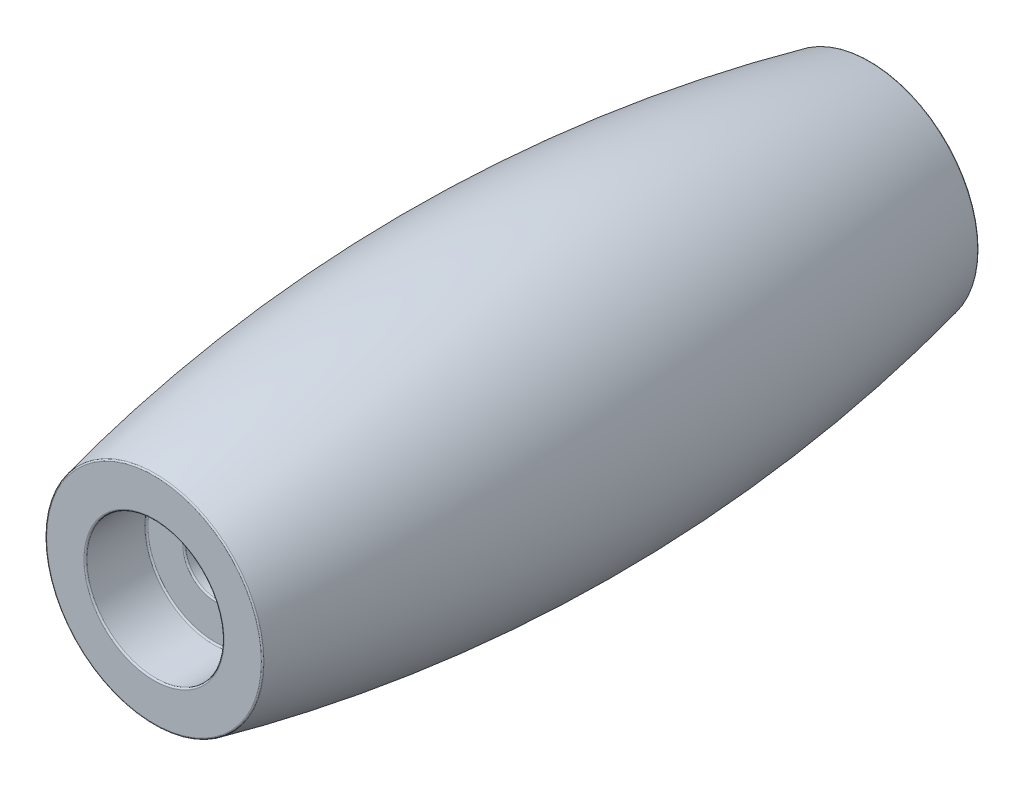
ISO-10303-21;
HEADER;
FILE_DESCRIPTION(('STEP AP214'),'2;1');
FILE_NAME('part.step','',(''),(''),'','','');
FILE_SCHEMA(('AUTOMOTIVE_DESIGN { 1 0 10303 214 1 1 1 1 }'));
ENDSEC;
DATA;
#1=APPLICATION_CONTEXT('core data for automotive mechanical design processes');
#2=APPLICATION_PROTOCOL_DEFINITION('international standard','automotive_design',2000,#1);
#3=PRODUCT_CONTEXT('',#1,'mechanical');
#4=PRODUCT('Part','Part','',(#3));
#5=PRODUCT_RELATED_PRODUCT_CATEGORY('part','',(#4));
#6=PRODUCT_DEFINITION_FORMATION('','',#4);
#7=PRODUCT_DEFINITION_CONTEXT('part definition',#1,'design');
#8=PRODUCT_DEFINITION('design','',#6,#7);
#9=PRODUCT_DEFINITION_SHAPE('','',#8);
#10=(LENGTH_UNIT() NAMED_UNIT(*) SI_UNIT(.MILLI.,.METRE.));
#11=(NAMED_UNIT(*) PLANE_ANGLE_UNIT() SI_UNIT($,.RADIAN.));
#12=(NAMED_UNIT(*) SI_UNIT($,.STERADIAN.) SOLID_ANGLE_UNIT());
#13=UNCERTAINTY_MEASURE_WITH_UNIT(LENGTH_MEASURE(1.E-05),#10,'distance_accuracy_value','');
#14=(GEOMETRIC_REPRESENTATION_CONTEXT(3) GLOBAL_UNCERTAINTY_ASSIGNED_CONTEXT((#13)) GLOBAL_UNIT_ASSIGNED_CONTEXT((#10,
#11,#12)) REPRESENTATION_CONTEXT('',''));
#15=CARTESIAN_POINT('',(0.,0.,0.));
#16=DIRECTION('',(0.,0.,1.));
#17=DIRECTION('',(1.,0.,0.));
#18=AXIS2_PLACEMENT_3D('',#15,#16,#17);
#19=CARTESIAN_POINT('',(2.00000000000001,0.,-19.5));
#20=DIRECTION('',(0.,0.,1.));
#21=DIRECTION('',(1.,0.,0.));
#22=AXIS2_PLACEMENT_3D('',#19,#20,#21);
#23=PLANE('',#22);
#24=CARTESIAN_POINT('',(0.,0.,-19.5));
#25=DIRECTION('',(0.,0.,1.));
#26=DIRECTION('',(1.,0.,0.));
#27=AXIS2_PLACEMENT_3D('',#24,#25,#26);
#28=CIRCLE('',#27,2.10000000000001);
#29=CARTESIAN_POINT('',(2.1,0.,-19.5));
#30=VERTEX_POINT('',#29);
#31=EDGE_CURVE('E75',#30,#30,#28,.T.);
#32=ORIENTED_EDGE('',*,*,#31,.T.);
#33=EDGE_LOOP('',(#32));
#34=FACE_BOUND('',#33,.T.);
#35=CARTESIAN_POINT('',(0.,0.,-19.5));
#36=DIRECTION('',(0.,0.,1.));
#37=DIRECTION('',(1.,0.,0.));
#38=AXIS2_PLACEMENT_3D('',#35,#36,#37);
#39=CIRCLE('',#38,4.40000000000002);
#40=CARTESIAN_POINT('',(4.40000000000001,0.,-19.5));
#41=VERTEX_POINT('',#40);
#42=EDGE_CURVE('E78',#41,#41,#39,.F.);
#43=ORIENTED_EDGE('',*,*,#42,.T.);
#44=EDGE_LOOP('',(#43));
#45=FACE_BOUND('',#44,.T.);
#46=ADVANCED_FACE('F31',(#34,#45),#23,.F.);
#47=CARTESIAN_POINT('',(0.,0.,-23.5));
#48=DIRECTION('',(0.,0.,-1.));
#49=DIRECTION('',(-1.,0.,0.));
#50=AXIS2_PLACEMENT_3D('',#47,#48,#49);
#51=CYLINDRICAL_SURFACE('',#50,4.50000000000002);
#52=CARTESIAN_POINT('',(0.,0.,-19.6));
#53=DIRECTION('',(0.,0.,1.));
#54=DIRECTION('',(1.,0.,0.));
#55=AXIS2_PLACEMENT_3D('',#52,#53,#54);
#56=CIRCLE('',#55,4.50000000000002);
#57=CARTESIAN_POINT('',(4.50000000000001,0.,-19.6));
#58=VERTEX_POINT('',#57);
#59=EDGE_CURVE('E69',#58,#58,#56,.T.);
#60=ORIENTED_EDGE('',*,*,#59,.T.);
#61=EDGE_LOOP('',(#60));
#62=FACE_BOUND('',#61,.T.);
#63=CARTESIAN_POINT('',(0.,0.,-23.4));
#64=DIRECTION('',(0.,0.,1.));
#65=DIRECTION('',(1.,0.,0.));
#66=AXIS2_PLACEMENT_3D('',#63,#64,#65);
#67=CIRCLE('',#66,4.50000000000002);
#68=CARTESIAN_POINT('',(4.5,0.,-23.4));
#69=VERTEX_POINT('',#68);
#70=EDGE_CURVE('E72',#69,#69,#67,.F.);
#71=ORIENTED_EDGE('',*,*,#70,.T.);
#72=EDGE_LOOP('',(#71));
#73=FACE_BOUND('',#72,.T.);
#74=ADVANCED_FACE('F124',(#62,#73),#51,.F.);
#75=CARTESIAN_POINT('',(4.5,0.,-23.5));
#76=DIRECTION('',(0.,0.,1.));
#77=DIRECTION('',(1.,0.,0.));
#78=AXIS2_PLACEMENT_3D('',#75,#76,#77);
#79=PLANE('',#78);
#80=CARTESIAN_POINT('',(0.,0.,-23.5));
#81=DIRECTION('',(0.,0.,1.));
#82=DIRECTION('',(1.,0.,0.));
#83=AXIS2_PLACEMENT_3D('',#80,#81,#82);
#84=CIRCLE('',#83,4.60000000000002);
#85=CARTESIAN_POINT('',(4.6,0.,-23.5));
#86=VERTEX_POINT('',#85);
#87=EDGE_CURVE('E63',#86,#86,#84,.T.);
#88=ORIENTED_EDGE('',*,*,#87,.T.);
#89=EDGE_LOOP('',(#88));
#90=FACE_BOUND('',#89,.T.);
#91=CARTESIAN_POINT('',(0.,0.,-23.5));
#92=DIRECTION('',(0.,0.,1.));
#93=DIRECTION('',(1.,0.,0.));
#94=AXIS2_PLACEMENT_3D('',#91,#92,#93);
#95=CIRCLE('',#94,7.044892785145);
#96=CARTESIAN_POINT('',(7.04489278514499,0.,-23.5));
#97=VERTEX_POINT('',#96);
#98=EDGE_CURVE('E66',#97,#97,#95,.F.);
#99=ORIENTED_EDGE('',*,*,#98,.T.);
#100=EDGE_LOOP('',(#99));
#101=FACE_BOUND('',#100,.T.);
#102=ADVANCED_FACE('F130',(#90,#101),#79,.F.);
#103=CARTESIAN_POINT('',(0.,0.,0.));
#104=DIRECTION('',(0.,0.,-1.));
#105=DIRECTION('',(-1.,0.,0.));
#106=AXIS2_PLACEMENT_3D('',#103,#104,#105);
#107=DEGENERATE_TOROIDAL_SURFACE('',#106,97.7769230769233,107.501923076923,.F.);
#108=CARTESIAN_POINT('',(0.,0.,-23.421787319379));
#109=DIRECTION('',(0.,0.,1.));
#110=DIRECTION('',(1.,0.,0.));
#111=AXIS2_PLACEMENT_3D('',#108,#109,#110);
#112=CIRCLE('',#111,7.14249049369534);
#113=CARTESIAN_POINT('',(7.14249049369533,0.,-23.421787319379));
#114=VERTEX_POINT('',#113);
#115=EDGE_CURVE('E57',#114,#114,#112,.T.);
#116=ORIENTED_EDGE('',*,*,#115,.T.);
#117=EDGE_LOOP('',(#116));
#118=FACE_BOUND('',#117,.T.);
#119=CARTESIAN_POINT('',(0.,0.,23.421787319379));
#120=DIRECTION('',(0.,0.,-1.));
#121=DIRECTION('',(-1.,0.,0.));
#122=AXIS2_PLACEMENT_3D('',#119,#120,#121);
#123=CIRCLE('',#122,7.14249049369533);
#124=CARTESIAN_POINT('',(-7.14249049369532,0.,23.421787319379));
#125=VERTEX_POINT('',#124);
#126=EDGE_CURVE('E60',#125,#125,#123,.T.);
#127=ORIENTED_EDGE('',*,*,#126,.T.);
#128=EDGE_LOOP('',(#127));
#129=FACE_BOUND('',#128,.T.);
#130=ADVANCED_FACE('F157',(#118,#129),#107,.F.);
#131=CARTESIAN_POINT('',(4.5,0.,23.5));
#132=DIRECTION('',(0.,0.,-1.));
#133=DIRECTION('',(-1.,0.,0.));
#134=AXIS2_PLACEMENT_3D('',#131,#132,#133);
#135=PLANE('',#134);
#136=CARTESIAN_POINT('',(0.,0.,23.5));
#137=DIRECTION('',(0.,0.,-1.));
#138=DIRECTION('',(-1.,0.,0.));
#139=AXIS2_PLACEMENT_3D('',#136,#137,#138);
#140=CIRCLE('',#139,4.60000000000001);
#141=CARTESIAN_POINT('',(-4.60000000000001,0.,23.5));
#142=VERTEX_POINT('',#141);
#143=EDGE_CURVE('E10',#142,#142,#140,.T.);
#144=ORIENTED_EDGE('',*,*,#143,.T.);
#145=EDGE_LOOP('',(#144));
#146=FACE_BOUND('',#145,.T.);
#147=CARTESIAN_POINT('',(0.,0.,23.5));
#148=DIRECTION('',(0.,0.,-1.));
#149=DIRECTION('',(-1.,0.,0.));
#150=AXIS2_PLACEMENT_3D('',#147,#148,#149);
#151=CIRCLE('',#150,7.04489278514499);
#152=CARTESIAN_POINT('',(-7.04489278514498,0.,23.5));
#153=VERTEX_POINT('',#152);
#154=EDGE_CURVE('E38',#153,#153,#151,.F.);
#155=ORIENTED_EDGE('',*,*,#154,.T.);
#156=EDGE_LOOP('',(#155));
#157=FACE_BOUND('',#156,.T.);
#158=ADVANCED_FACE('F113',(#146,#157),#135,.F.);
#159=CARTESIAN_POINT('',(0.,0.,-23.5));
#160=DIRECTION('',(0.,0.,-1.));
#161=DIRECTION('',(-1.,0.,0.));
#162=AXIS2_PLACEMENT_3D('',#159,#160,#161);
#163=CYLINDRICAL_SURFACE('',#162,4.50000000000001);
#164=CARTESIAN_POINT('',(0.,0.,19.6));
#165=DIRECTION('',(0.,0.,-1.));
#166=DIRECTION('',(-1.,0.,0.));
#167=AXIS2_PLACEMENT_3D('',#164,#165,#166);
#168=CIRCLE('',#167,4.50000000000001);
#169=CARTESIAN_POINT('',(-4.50000000000001,0.,19.6));
#170=VERTEX_POINT('',#169);
#171=EDGE_CURVE('E42',#170,#170,#168,.T.);
#172=ORIENTED_EDGE('',*,*,#171,.T.);
#173=EDGE_LOOP('',(#172));
#174=FACE_BOUND('',#173,.T.);
#175=CARTESIAN_POINT('',(0.,0.,23.4));
#176=DIRECTION('',(0.,0.,-1.));
#177=DIRECTION('',(-1.,0.,0.));
#178=AXIS2_PLACEMENT_3D('',#175,#176,#177);
#179=CIRCLE('',#178,4.50000000000001);
#180=CARTESIAN_POINT('',(-4.50000000000001,0.,23.4));
#181=VERTEX_POINT('',#180);
#182=EDGE_CURVE('E46',#181,#181,#179,.F.);
#183=ORIENTED_EDGE('',*,*,#182,.T.);
#184=EDGE_LOOP('',(#183));
#185=FACE_BOUND('',#184,.T.);
#186=ADVANCED_FACE('F101',(#174,#185),#163,.F.);
#187=CARTESIAN_POINT('',(2.00000000000001,0.,19.5));
#188=DIRECTION('',(0.,0.,-1.));
#189=DIRECTION('',(-1.,0.,0.));
#190=AXIS2_PLACEMENT_3D('',#187,#188,#189);
#191=PLANE('',#190);
#192=CARTESIAN_POINT('',(0.,0.,19.5));
#193=DIRECTION('',(0.,0.,-1.));
#194=DIRECTION('',(-1.,0.,0.));
#195=AXIS2_PLACEMENT_3D('',#192,#193,#194);
#196=CIRCLE('',#195,2.10000000000001);
#197=CARTESIAN_POINT('',(-2.10000000000001,0.,19.5));
#198=VERTEX_POINT('',#197);
#199=EDGE_CURVE('E51',#198,#198,#196,.T.);
#200=ORIENTED_EDGE('',*,*,#199,.T.);
#201=EDGE_LOOP('',(#200));
#202=FACE_BOUND('',#201,.T.);
#203=CARTESIAN_POINT('',(0.,0.,19.5));
#204=DIRECTION('',(0.,0.,-1.));
#205=DIRECTION('',(-1.,0.,0.));
#206=AXIS2_PLACEMENT_3D('',#203,#204,#205);
#207=CIRCLE('',#206,4.40000000000001);
#208=CARTESIAN_POINT('',(-4.40000000000001,0.,19.5));
#209=VERTEX_POINT('',#208);
#210=EDGE_CURVE('E54',#209,#209,#207,.F.);
#211=ORIENTED_EDGE('',*,*,#210,.T.);
#212=EDGE_LOOP('',(#211));
#213=FACE_BOUND('',#212,.T.);
#214=ADVANCED_FACE('F98',(#202,#213),#191,.F.);
#215=CARTESIAN_POINT('',(0.,0.,-23.5));
#216=DIRECTION('',(0.,0.,-1.));
#217=DIRECTION('',(-1.,0.,0.));
#218=AXIS2_PLACEMENT_3D('',#215,#216,#217);
#219=CYLINDRICAL_SURFACE('',#218,2.00000000000001);
#220=CARTESIAN_POINT('',(0.,0.,-19.4));
#221=DIRECTION('',(0.,0.,1.));
#222=DIRECTION('',(1.,0.,0.));
#223=AXIS2_PLACEMENT_3D('',#220,#221,#222);
#224=CIRCLE('',#223,2.00000000000001);
#225=CARTESIAN_POINT('',(2.,0.,-19.4));
#226=VERTEX_POINT('',#225);
#227=EDGE_CURVE('E81',#226,#226,#224,.F.);
#228=ORIENTED_EDGE('',*,*,#227,.T.);
#229=EDGE_LOOP('',(#228));
#230=FACE_BOUND('',#229,.T.);
#231=CARTESIAN_POINT('',(0.,0.,19.4));
#232=DIRECTION('',(0.,0.,-1.));
#233=DIRECTION('',(-1.,0.,0.));
#234=AXIS2_PLACEMENT_3D('',#231,#232,#233);
#235=CIRCLE('',#234,2.00000000000001);
#236=CARTESIAN_POINT('',(-2.00000000000001,0.,19.4));
#237=VERTEX_POINT('',#236);
#238=EDGE_CURVE('E84',#237,#237,#235,.F.);
#239=ORIENTED_EDGE('',*,*,#238,.T.);
#240=EDGE_LOOP('',(#239));
#241=FACE_BOUND('',#240,.T.);
#242=ADVANCED_FACE('F88',(#230,#241),#219,.F.);
#243=CARTESIAN_POINT('',(0.,0.,-19.4));
#244=DIRECTION('',(0.,0.,1.));
#245=DIRECTION('',(1.,0.,0.));
#246=AXIS2_PLACEMENT_3D('',#243,#244,#245);
#247=TOROIDAL_SURFACE('',#246,2.10000000000001,0.1);
#248=ORIENTED_EDGE('',*,*,#31,.F.);
#249=EDGE_LOOP('',(#248));
#250=FACE_BOUND('',#249,.T.);
#251=ORIENTED_EDGE('',*,*,#227,.F.);
#252=EDGE_LOOP('',(#251));
#253=FACE_BOUND('',#252,.T.);
#254=ADVANCED_FACE('F136',(#250,#253),#247,.T.);
#255=CARTESIAN_POINT('',(0.,0.,-19.6));
#256=DIRECTION('',(0.,0.,1.));
#257=DIRECTION('',(1.,0.,0.));
#258=AXIS2_PLACEMENT_3D('',#255,#256,#257);
#259=TOROIDAL_SURFACE('',#258,4.40000000000002,0.1);
#260=ORIENTED_EDGE('',*,*,#59,.F.);
#261=EDGE_LOOP('',(#260));
#262=FACE_BOUND('',#261,.T.);
#263=ORIENTED_EDGE('',*,*,#42,.F.);
#264=EDGE_LOOP('',(#263));
#265=FACE_BOUND('',#264,.T.);
#266=ADVANCED_FACE('F139',(#262,#265),#259,.F.);
#267=CARTESIAN_POINT('',(0.,0.,-23.4));
#268=DIRECTION('',(0.,0.,1.));
#269=DIRECTION('',(1.,0.,0.));
#270=AXIS2_PLACEMENT_3D('',#267,#268,#269);
#271=TOROIDAL_SURFACE('',#270,4.60000000000002,0.1);
#272=ORIENTED_EDGE('',*,*,#87,.F.);
#273=EDGE_LOOP('',(#272));
#274=FACE_BOUND('',#273,.T.);
#275=ORIENTED_EDGE('',*,*,#70,.F.);
#276=EDGE_LOOP('',(#275));
#277=FACE_BOUND('',#276,.T.);
#278=ADVANCED_FACE('F143',(#274,#277),#271,.T.);
#279=CARTESIAN_POINT('',(0.,0.,-23.4));
#280=DIRECTION('',(0.,0.,1.));
#281=DIRECTION('',(1.,0.,0.));
#282=AXIS2_PLACEMENT_3D('',#279,#280,#281);
#283=TOROIDAL_SURFACE('',#282,7.044892785145,0.1);
#284=ORIENTED_EDGE('',*,*,#115,.F.);
#285=EDGE_LOOP('',(#284));
#286=FACE_BOUND('',#285,.T.);
#287=ORIENTED_EDGE('',*,*,#98,.F.);
#288=EDGE_LOOP('',(#287));
#289=FACE_BOUND('',#288,.T.);
#290=ADVANCED_FACE('F94',(#286,#289),#283,.T.);
#291=CARTESIAN_POINT('',(0.,0.,19.4));
#292=DIRECTION('',(0.,0.,-1.));
#293=DIRECTION('',(-1.,0.,0.));
#294=AXIS2_PLACEMENT_3D('',#291,#292,#293);
#295=TOROIDAL_SURFACE('',#294,2.10000000000001,0.1);
#296=ORIENTED_EDGE('',*,*,#238,.F.);
#297=EDGE_LOOP('',(#296));
#298=FACE_BOUND('',#297,.T.);
#299=ORIENTED_EDGE('',*,*,#199,.F.);
#300=EDGE_LOOP('',(#299));
#301=FACE_BOUND('',#300,.T.);
#302=ADVANCED_FACE('F90',(#298,#301),#295,.T.);
#303=CARTESIAN_POINT('',(0.,0.,19.6));
#304=DIRECTION('',(0.,0.,-1.));
#305=DIRECTION('',(-1.,0.,0.));
#306=AXIS2_PLACEMENT_3D('',#303,#304,#305);
#307=TOROIDAL_SURFACE('',#306,4.40000000000001,0.1);
#308=ORIENTED_EDGE('',*,*,#210,.F.);
#309=EDGE_LOOP('',(#308));
#310=FACE_BOUND('',#309,.T.);
#311=ORIENTED_EDGE('',*,*,#171,.F.);
#312=EDGE_LOOP('',(#311));
#313=FACE_BOUND('',#312,.T.);
#314=ADVANCED_FACE('F93',(#310,#313),#307,.F.);
#315=CARTESIAN_POINT('',(0.,0.,23.4));
#316=DIRECTION('',(0.,0.,-1.));
#317=DIRECTION('',(-1.,0.,0.));
#318=AXIS2_PLACEMENT_3D('',#315,#316,#317);
#319=TOROIDAL_SURFACE('',#318,4.60000000000001,0.1);
#320=ORIENTED_EDGE('',*,*,#182,.F.);
#321=EDGE_LOOP('',(#320));
#322=FACE_BOUND('',#321,.T.);
#323=ORIENTED_EDGE('',*,*,#143,.F.);
#324=EDGE_LOOP('',(#323));
#325=FACE_BOUND('',#324,.T.);
#326=ADVANCED_FACE('F107',(#322,#325),#319,.T.);
#327=CARTESIAN_POINT('',(0.,0.,23.4));
#328=DIRECTION('',(0.,0.,-1.));
#329=DIRECTION('',(-1.,0.,0.));
#330=AXIS2_PLACEMENT_3D('',#327,#328,#329);
#331=TOROIDAL_SURFACE('',#330,7.04489278514499,0.1);
#332=ORIENTED_EDGE('',*,*,#154,.F.);
#333=EDGE_LOOP('',(#332));
#334=FACE_BOUND('',#333,.T.);
#335=ORIENTED_EDGE('',*,*,#126,.F.);
#336=EDGE_LOOP('',(#335));
#337=FACE_BOUND('',#336,.T.);
#338=ADVANCED_FACE('F33',(#334,#337),#331,.T.);
#339=CLOSED_SHELL('',(#46,#74,#102,#130,#158,#186,#214,#242,#254,#266,#278,#290,#302,#314,#326,#338));
#340=MANIFOLD_SOLID_BREP('B2',#339);
#341=ADVANCED_BREP_SHAPE_REPRESENTATION('',(#18,#340),#14);
#342=SHAPE_DEFINITION_REPRESENTATION(#9,#341);
ENDSEC;
END-ISO-10303-21;
